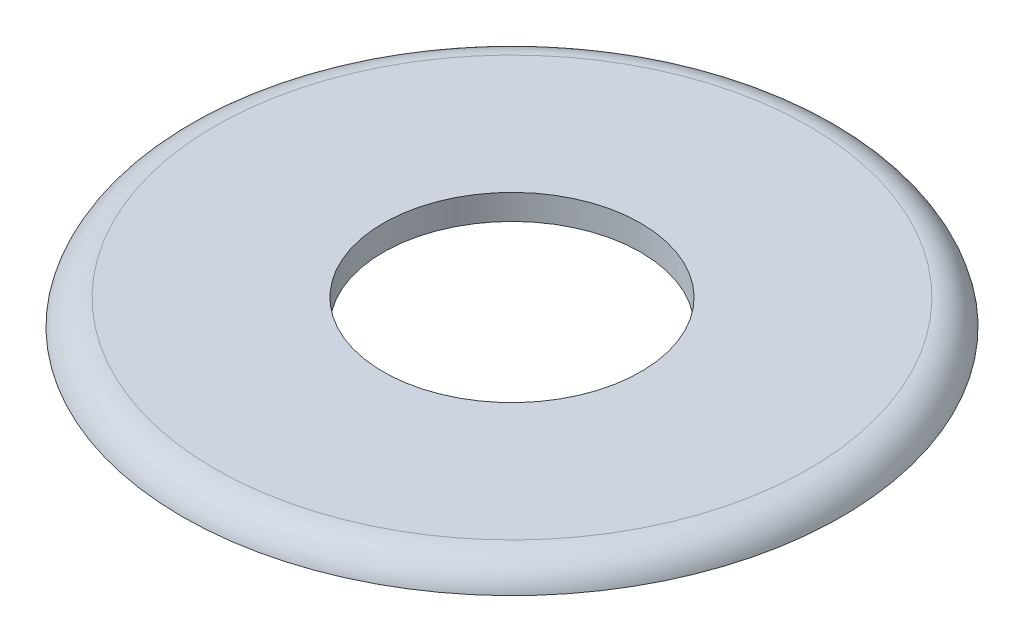
ISO-10303-21;
HEADER;
FILE_DESCRIPTION(('STEP AP214'),'2;1');
FILE_NAME('part.step','',(''),(''),'','','');
FILE_SCHEMA(('AUTOMOTIVE_DESIGN { 1 0 10303 214 1 1 1 1 }'));
ENDSEC;
DATA;
#1=APPLICATION_CONTEXT('core data for automotive mechanical design processes');
#2=APPLICATION_PROTOCOL_DEFINITION('international standard','automotive_design',2000,#1);
#3=PRODUCT_CONTEXT('',#1,'mechanical');
#4=PRODUCT('Part','Part','',(#3));
#5=PRODUCT_RELATED_PRODUCT_CATEGORY('part','',(#4));
#6=PRODUCT_DEFINITION_FORMATION('','',#4);
#7=PRODUCT_DEFINITION_CONTEXT('part definition',#1,'design');
#8=PRODUCT_DEFINITION('design','',#6,#7);
#9=PRODUCT_DEFINITION_SHAPE('','',#8);
#10=(LENGTH_UNIT() NAMED_UNIT(*) SI_UNIT(.MILLI.,.METRE.));
#11=(NAMED_UNIT(*) PLANE_ANGLE_UNIT() SI_UNIT($,.RADIAN.));
#12=(NAMED_UNIT(*) SI_UNIT($,.STERADIAN.) SOLID_ANGLE_UNIT());
#13=UNCERTAINTY_MEASURE_WITH_UNIT(LENGTH_MEASURE(1.E-05),#10,'distance_accuracy_value','');
#14=(GEOMETRIC_REPRESENTATION_CONTEXT(3) GLOBAL_UNCERTAINTY_ASSIGNED_CONTEXT((#13)) GLOBAL_UNIT_ASSIGNED_CONTEXT((#10,
#11,#12)) REPRESENTATION_CONTEXT('',''));
#15=CARTESIAN_POINT('',(0.,0.,0.));
#16=DIRECTION('',(0.,0.,1.));
#17=DIRECTION('',(1.,0.,0.));
#18=AXIS2_PLACEMENT_3D('',#15,#16,#17);
#19=CARTESIAN_POINT('',(0.,2.9464,-2.64583333333418));
#20=DIRECTION('',(0.,1.,0.));
#21=DIRECTION('',(0.,0.,1.));
#22=AXIS2_PLACEMENT_3D('',#19,#20,#21);
#23=PLANE('',#22);
#24=CARTESIAN_POINT('',(0.,2.9464,0.));
#25=DIRECTION('',(0.,-1.,0.));
#26=DIRECTION('',(0.,0.,-1.));
#27=AXIS2_PLACEMENT_3D('',#24,#25,#26);
#28=CIRCLE('',#27,1.14747368442523);
#29=CARTESIAN_POINT('',(0.,2.9464,-1.14747368442523));
#30=VERTEX_POINT('',#29);
#31=EDGE_CURVE('E44',#30,#30,#28,.T.);
#32=ORIENTED_EDGE('',*,*,#31,.T.);
#33=EDGE_LOOP('',(#32));
#34=FACE_BOUND('',#33,.T.);
#35=CARTESIAN_POINT('',(0.,2.94640000000076,0.));
#36=DIRECTION('',(0.,-1.,0.));
#37=DIRECTION('',(0.,0.,1.));
#38=AXIS2_PLACEMENT_3D('',#35,#36,#37);
#39=CIRCLE('',#38,2.64583333333418);
#40=CARTESIAN_POINT('',(0.,2.94640000000046,2.64583333333418));
#41=VERTEX_POINT('',#40);
#42=CARTESIAN_POINT('',(0.,2.94640000000046,-2.64583333333418));
#43=VERTEX_POINT('',#42);
#44=EDGE_CURVE('E34',#41,#43,#39,.T.);
#45=ORIENTED_EDGE('',*,*,#44,.F.);
#46=CARTESIAN_POINT('',(0.,2.94640000000076,0.));
#47=DIRECTION('',(0.,-1.,0.));
#48=DIRECTION('',(0.,0.,-1.));
#49=AXIS2_PLACEMENT_3D('',#46,#47,#48);
#50=CIRCLE('',#49,2.64583333333418);
#51=EDGE_CURVE('E38',#43,#41,#50,.T.);
#52=ORIENTED_EDGE('',*,*,#51,.F.);
#53=EDGE_LOOP('',(#45,#52));
#54=FACE_BOUND('',#53,.T.);
#55=ADVANCED_FACE('F17',(#34,#54),#23,.T.);
#56=CARTESIAN_POINT('',(0.,2.64583333333418,0.));
#57=DIRECTION('',(0.,-1.,0.));
#58=DIRECTION('',(0.,0.,-1.));
#59=AXIS2_PLACEMENT_3D('',#56,#57,#58);
#60=TOROIDAL_SURFACE('',#59,2.64583333333418,0.300566666666582);
#61=CARTESIAN_POINT('',(0.,2.72203333333418,0.));
#62=DIRECTION('',(0.,-1.,0.));
#63=DIRECTION('',(0.,0.,-1.));
#64=AXIS2_PLACEMENT_3D('',#61,#62,#63);
#65=CIRCLE('',#64,2.93658044185129);
#66=CARTESIAN_POINT('',(0.,2.72203333333418,-2.93658044185129));
#67=VERTEX_POINT('',#66);
#68=EDGE_CURVE('E28',#67,#67,#65,.T.);
#69=ORIENTED_EDGE('',*,*,#68,.F.);
#70=EDGE_LOOP('',(#69));
#71=FACE_BOUND('',#70,.T.);
#72=ORIENTED_EDGE('',*,*,#51,.T.);
#73=ORIENTED_EDGE('',*,*,#44,.T.);
#74=EDGE_LOOP('',(#72,#73));
#75=FACE_BOUND('',#74,.T.);
#76=ADVANCED_FACE('F43',(#71,#75),#60,.T.);
#77=CARTESIAN_POINT('',(0.,2.72203333333418,0.));
#78=DIRECTION('',(0.,-1.,0.));
#79=DIRECTION('',(0.,0.,-1.));
#80=AXIS2_PLACEMENT_3D('',#77,#78,#79);
#81=CYLINDRICAL_SURFACE('',#80,1.14747368442523);
#82=CARTESIAN_POINT('',(0.,2.72203333333418,0.));
#83=DIRECTION('',(0.,-1.,0.));
#84=DIRECTION('',(0.,0.,-1.));
#85=AXIS2_PLACEMENT_3D('',#82,#83,#84);
#86=CIRCLE('',#85,1.14747368442523);
#87=CARTESIAN_POINT('',(0.,2.72203333333418,-1.14747368442523));
#88=VERTEX_POINT('',#87);
#89=EDGE_CURVE('E11',#88,#88,#86,.F.);
#90=ORIENTED_EDGE('',*,*,#89,.F.);
#91=EDGE_LOOP('',(#90));
#92=FACE_BOUND('',#91,.T.);
#93=ORIENTED_EDGE('',*,*,#31,.F.);
#94=EDGE_LOOP('',(#93));
#95=FACE_BOUND('',#94,.T.);
#96=ADVANCED_FACE('F60',(#92,#95),#81,.F.);
#97=CARTESIAN_POINT('',(0.,2.72203333333418,-1.14747368442523));
#98=DIRECTION('',(0.,-1.,0.));
#99=DIRECTION('',(0.,0.,-1.));
#100=AXIS2_PLACEMENT_3D('',#97,#98,#99);
#101=PLANE('',#100);
#102=ORIENTED_EDGE('',*,*,#89,.T.);
#103=EDGE_LOOP('',(#102));
#104=FACE_BOUND('',#103,.T.);
#105=ORIENTED_EDGE('',*,*,#68,.T.);
#106=EDGE_LOOP('',(#105));
#107=FACE_BOUND('',#106,.T.);
#108=ADVANCED_FACE('F66',(#104,#107),#101,.T.);
#109=CLOSED_SHELL('',(#55,#76,#96,#108));
#110=MANIFOLD_SOLID_BREP('B1',#109);
#111=ADVANCED_BREP_SHAPE_REPRESENTATION('',(#18,#110),#14);
#112=SHAPE_DEFINITION_REPRESENTATION(#9,#111);
ENDSEC;
END-ISO-10303-21;
